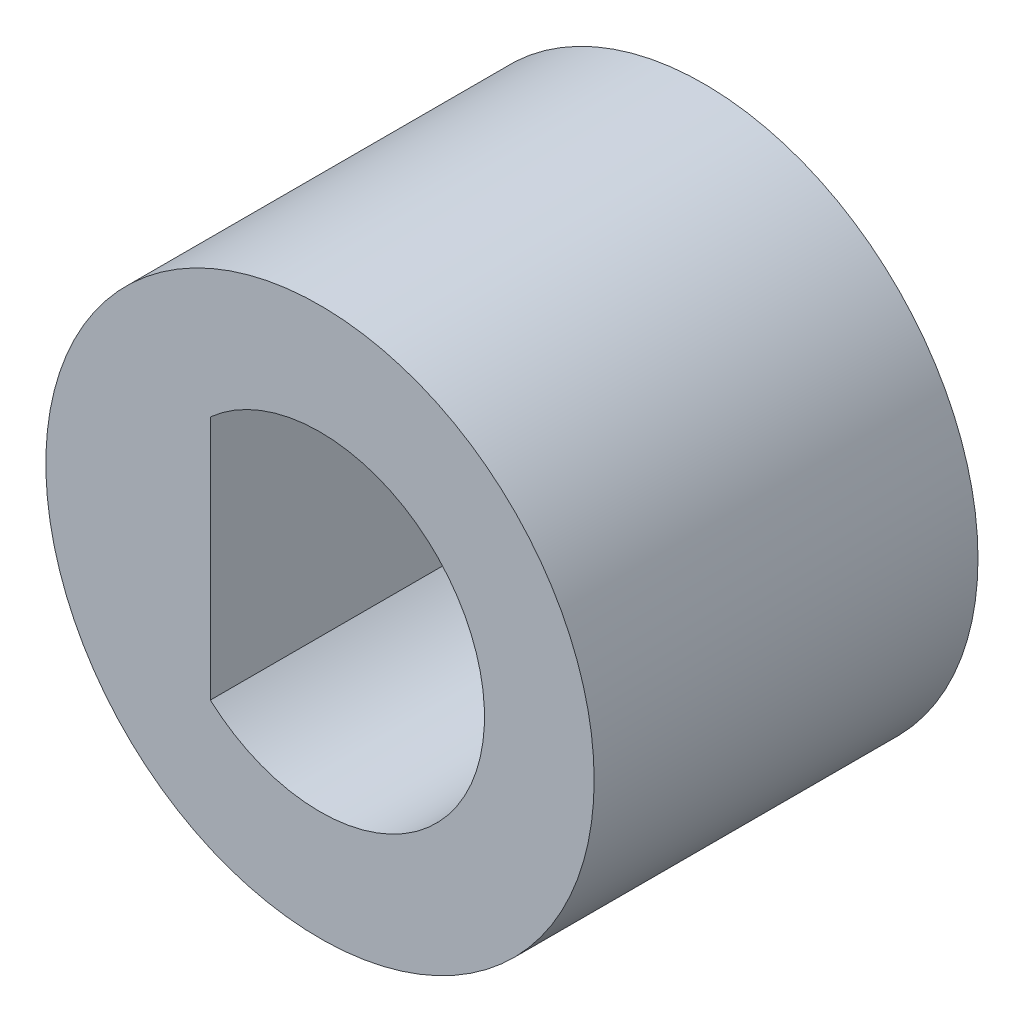
ISO-10303-21;
HEADER;
FILE_DESCRIPTION(('STEP AP214'),'2;1');
FILE_NAME('part.step','',(''),(''),'','','');
FILE_SCHEMA(('AUTOMOTIVE_DESIGN { 1 0 10303 214 1 1 1 1 }'));
ENDSEC;
DATA;
#1=APPLICATION_CONTEXT('core data for automotive mechanical design processes');
#2=APPLICATION_PROTOCOL_DEFINITION('international standard','automotive_design',2000,#1);
#3=PRODUCT_CONTEXT('',#1,'mechanical');
#4=PRODUCT('Part','Part','',(#3));
#5=PRODUCT_RELATED_PRODUCT_CATEGORY('part','',(#4));
#6=PRODUCT_DEFINITION_FORMATION('','',#4);
#7=PRODUCT_DEFINITION_CONTEXT('part definition',#1,'design');
#8=PRODUCT_DEFINITION('design','',#6,#7);
#9=PRODUCT_DEFINITION_SHAPE('','',#8);
#10=(LENGTH_UNIT() NAMED_UNIT(*) SI_UNIT(.MILLI.,.METRE.));
#11=(NAMED_UNIT(*) PLANE_ANGLE_UNIT() SI_UNIT($,.RADIAN.));
#12=(NAMED_UNIT(*) SI_UNIT($,.STERADIAN.) SOLID_ANGLE_UNIT());
#13=UNCERTAINTY_MEASURE_WITH_UNIT(LENGTH_MEASURE(1.E-05),#10,'distance_accuracy_value','');
#14=(GEOMETRIC_REPRESENTATION_CONTEXT(3) GLOBAL_UNCERTAINTY_ASSIGNED_CONTEXT((#13)) GLOBAL_UNIT_ASSIGNED_CONTEXT((#10,
#11,#12)) REPRESENTATION_CONTEXT('',''));
#15=CARTESIAN_POINT('',(0.,0.,0.));
#16=DIRECTION('',(0.,0.,1.));
#17=DIRECTION('',(1.,0.,0.));
#18=AXIS2_PLACEMENT_3D('',#15,#16,#17);
#19=CARTESIAN_POINT('',(0.,0.,7.00000000000001));
#20=DIRECTION('',(0.,0.,-1.));
#21=DIRECTION('',(-1.,0.,0.));
#22=AXIS2_PLACEMENT_3D('',#19,#20,#21);
#23=CYLINDRICAL_SURFACE('',#22,3.);
#24=CARTESIAN_POINT('',(0.,0.,0.));
#25=DIRECTION('',(0.,0.,1.));
#26=DIRECTION('',(1.,0.,0.));
#27=AXIS2_PLACEMENT_3D('',#24,#25,#26);
#28=CIRCLE('',#27,3.);
#29=CARTESIAN_POINT('',(-2.,-2.23606797749979,0.));
#30=VERTEX_POINT('',#29);
#31=CARTESIAN_POINT('',(-2.,2.23606797749979,0.));
#32=VERTEX_POINT('',#31);
#33=EDGE_CURVE('E67',#30,#32,#28,.T.);
#34=ORIENTED_EDGE('',*,*,#33,.F.);
#35=DIRECTION('',(0.,0.,-1.));
#36=VECTOR('',#35,1.);
#37=CARTESIAN_POINT('',(-2.,-2.23606797749979,7.00000000000001));
#38=LINE('',#37,#36);
#39=CARTESIAN_POINT('',(-2.,-2.23606797749979,7.00000000000001));
#40=VERTEX_POINT('',#39);
#41=EDGE_CURVE('E11',#40,#30,#38,.T.);
#42=ORIENTED_EDGE('',*,*,#41,.F.);
#43=CARTESIAN_POINT('',(0.,0.,7.00000000000001));
#44=DIRECTION('',(0.,0.,1.));
#45=DIRECTION('',(1.,0.,0.));
#46=AXIS2_PLACEMENT_3D('',#43,#44,#45);
#47=CIRCLE('',#46,3.);
#48=CARTESIAN_POINT('',(-2.,2.23606797749979,7.00000000000001));
#49=VERTEX_POINT('',#48);
#50=EDGE_CURVE('E70',#40,#49,#47,.T.);
#51=ORIENTED_EDGE('',*,*,#50,.T.);
#52=DIRECTION('',(0.,0.,-1.));
#53=VECTOR('',#52,1.);
#54=CARTESIAN_POINT('',(-2.,2.23606797749979,7.00000000000001));
#55=LINE('',#54,#53);
#56=EDGE_CURVE('E52',#49,#32,#55,.T.);
#57=ORIENTED_EDGE('',*,*,#56,.T.);
#58=EDGE_LOOP('',(#34,#42,#51,#57));
#59=FACE_BOUND('',#58,.T.);
#60=ADVANCED_FACE('F43',(#59),#23,.F.);
#61=CARTESIAN_POINT('',(-2.,0.,7.00000000000001));
#62=DIRECTION('',(1.,0.,0.));
#63=DIRECTION('',(0.,0.,-1.));
#64=AXIS2_PLACEMENT_3D('',#61,#62,#63);
#65=PLANE('',#64);
#66=DIRECTION('',(0.,-1.,0.));
#67=VECTOR('',#66,1.);
#68=CARTESIAN_POINT('',(-2.,0.,0.));
#69=LINE('',#68,#67);
#70=EDGE_CURVE('E77',#32,#30,#69,.T.);
#71=ORIENTED_EDGE('',*,*,#70,.F.);
#72=ORIENTED_EDGE('',*,*,#56,.F.);
#73=DIRECTION('',(0.,-1.,0.));
#74=VECTOR('',#73,1.);
#75=CARTESIAN_POINT('',(-2.,0.,7.00000000000001));
#76=LINE('',#75,#74);
#77=EDGE_CURVE('E91',#49,#40,#76,.T.);
#78=ORIENTED_EDGE('',*,*,#77,.T.);
#79=ORIENTED_EDGE('',*,*,#41,.T.);
#80=EDGE_LOOP('',(#71,#72,#78,#79));
#81=FACE_BOUND('',#80,.T.);
#82=ADVANCED_FACE('F80',(#81),#65,.T.);
#83=CARTESIAN_POINT('',(0.,0.,7.00000000000001));
#84=DIRECTION('',(0.,0.,-1.));
#85=DIRECTION('',(-1.,0.,0.));
#86=AXIS2_PLACEMENT_3D('',#83,#84,#85);
#87=CYLINDRICAL_SURFACE('',#86,5.);
#88=CARTESIAN_POINT('',(0.,0.,7.00000000000001));
#89=DIRECTION('',(0.,0.,1.));
#90=DIRECTION('',(1.,0.,0.));
#91=AXIS2_PLACEMENT_3D('',#88,#89,#90);
#92=CIRCLE('',#91,5.);
#93=CARTESIAN_POINT('',(5.,0.,7.00000000000001));
#94=VERTEX_POINT('',#93);
#95=EDGE_CURVE('E73',#94,#94,#92,.T.);
#96=ORIENTED_EDGE('',*,*,#95,.F.);
#97=EDGE_LOOP('',(#96));
#98=FACE_BOUND('',#97,.T.);
#99=CARTESIAN_POINT('',(0.,0.,0.));
#100=DIRECTION('',(0.,0.,1.));
#101=DIRECTION('',(1.,0.,0.));
#102=AXIS2_PLACEMENT_3D('',#99,#100,#101);
#103=CIRCLE('',#102,5.);
#104=CARTESIAN_POINT('',(5.,0.,0.));
#105=VERTEX_POINT('',#104);
#106=EDGE_CURVE('E82',#105,#105,#103,.T.);
#107=ORIENTED_EDGE('',*,*,#106,.T.);
#108=EDGE_LOOP('',(#107));
#109=FACE_BOUND('',#108,.T.);
#110=ADVANCED_FACE('F99',(#98,#109),#87,.T.);
#111=CARTESIAN_POINT('',(0.,0.,7.00000000000001));
#112=DIRECTION('',(0.,0.,1.));
#113=DIRECTION('',(1.,0.,0.));
#114=AXIS2_PLACEMENT_3D('',#111,#112,#113);
#115=PLANE('',#114);
#116=ORIENTED_EDGE('',*,*,#50,.F.);
#117=ORIENTED_EDGE('',*,*,#77,.F.);
#118=EDGE_LOOP('',(#116,#117));
#119=FACE_BOUND('',#118,.T.);
#120=ORIENTED_EDGE('',*,*,#95,.T.);
#121=EDGE_LOOP('',(#120));
#122=FACE_BOUND('',#121,.T.);
#123=ADVANCED_FACE('F96',(#119,#122),#115,.T.);
#124=CARTESIAN_POINT('',(0.,0.,0.));
#125=DIRECTION('',(0.,0.,1.));
#126=DIRECTION('',(1.,0.,0.));
#127=AXIS2_PLACEMENT_3D('',#124,#125,#126);
#128=PLANE('',#127);
#129=ORIENTED_EDGE('',*,*,#33,.T.);
#130=ORIENTED_EDGE('',*,*,#70,.T.);
#131=EDGE_LOOP('',(#129,#130));
#132=FACE_BOUND('',#131,.T.);
#133=ORIENTED_EDGE('',*,*,#106,.F.);
#134=EDGE_LOOP('',(#133));
#135=FACE_BOUND('',#134,.T.);
#136=ADVANCED_FACE('F75',(#132,#135),#128,.F.);
#137=CLOSED_SHELL('',(#60,#82,#110,#123,#136));
#138=MANIFOLD_SOLID_BREP('B2',#137);
#139=ADVANCED_BREP_SHAPE_REPRESENTATION('',(#18,#138),#14);
#140=SHAPE_DEFINITION_REPRESENTATION(#9,#139);
ENDSEC;
END-ISO-10303-21;
